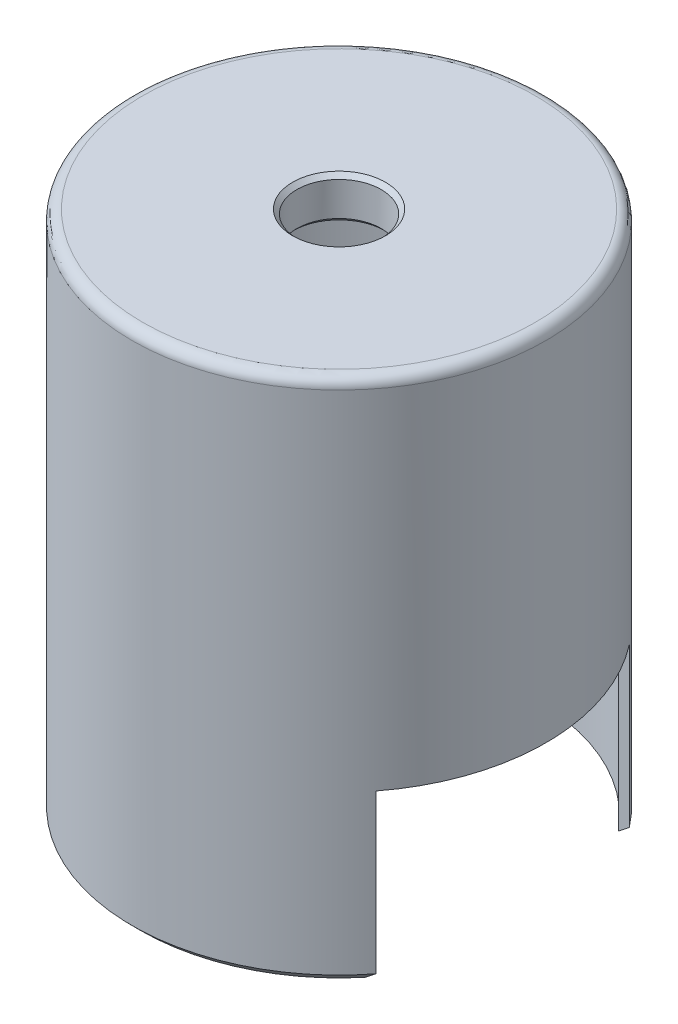
ISO-10303-21;
HEADER;
FILE_DESCRIPTION(('STEP AP214'),'2;1');
FILE_NAME('part.step','',(''),(''),'','','');
FILE_SCHEMA(('AUTOMOTIVE_DESIGN { 1 0 10303 214 1 1 1 1 }'));
ENDSEC;
DATA;
#1=APPLICATION_CONTEXT('core data for automotive mechanical design processes');
#2=APPLICATION_PROTOCOL_DEFINITION('international standard','automotive_design',2000,#1);
#3=PRODUCT_CONTEXT('',#1,'mechanical');
#4=PRODUCT('Part','Part','',(#3));
#5=PRODUCT_RELATED_PRODUCT_CATEGORY('part','',(#4));
#6=PRODUCT_DEFINITION_FORMATION('','',#4);
#7=PRODUCT_DEFINITION_CONTEXT('part definition',#1,'design');
#8=PRODUCT_DEFINITION('design','',#6,#7);
#9=PRODUCT_DEFINITION_SHAPE('','',#8);
#10=(LENGTH_UNIT() NAMED_UNIT(*) SI_UNIT(.MILLI.,.METRE.));
#11=(NAMED_UNIT(*) PLANE_ANGLE_UNIT() SI_UNIT($,.RADIAN.));
#12=(NAMED_UNIT(*) SI_UNIT($,.STERADIAN.) SOLID_ANGLE_UNIT());
#13=UNCERTAINTY_MEASURE_WITH_UNIT(LENGTH_MEASURE(1.E-05),#10,'distance_accuracy_value','');
#14=(GEOMETRIC_REPRESENTATION_CONTEXT(3) GLOBAL_UNCERTAINTY_ASSIGNED_CONTEXT((#13)) GLOBAL_UNIT_ASSIGNED_CONTEXT((#10,
#11,#12)) REPRESENTATION_CONTEXT('',''));
#15=CARTESIAN_POINT('',(0.,0.,0.));
#16=DIRECTION('',(0.,0.,1.));
#17=DIRECTION('',(1.,0.,0.));
#18=AXIS2_PLACEMENT_3D('',#15,#16,#17);
#19=CARTESIAN_POINT('',(0.,25.,0.));
#20=DIRECTION('',(0.,-1.,0.));
#21=DIRECTION('',(0.,0.,-1.));
#22=AXIS2_PLACEMENT_3D('',#19,#20,#21);
#23=CYLINDRICAL_SURFACE('',#22,9.8);
#24=CARTESIAN_POINT('',(0.,24.5,0.));
#25=DIRECTION('',(0.,1.,0.));
#26=DIRECTION('',(0.,0.,1.));
#27=AXIS2_PLACEMENT_3D('',#24,#25,#26);
#28=CIRCLE('',#27,9.8);
#29=CARTESIAN_POINT('',(0.,24.5,9.8));
#30=VERTEX_POINT('',#29);
#31=EDGE_CURVE('E168',#30,#30,#28,.F.);
#32=ORIENTED_EDGE('',*,*,#31,.T.);
#33=EDGE_LOOP('',(#32));
#34=FACE_BOUND('',#33,.T.);
#35=DIRECTION('',(0.,-1.,0.));
#36=VECTOR('',#35,1.);
#37=CARTESIAN_POINT('',(-7.74854825112421,25.,6.));
#38=LINE('',#37,#36);
#39=CARTESIAN_POINT('',(-7.74854825112421,8.00000000000001,6.));
#40=VERTEX_POINT('',#39);
#41=CARTESIAN_POINT('',(-7.74854825112421,0.500000000000007,6.));
#42=VERTEX_POINT('',#41);
#43=EDGE_CURVE('E157',#40,#42,#38,.T.);
#44=ORIENTED_EDGE('',*,*,#43,.T.);
#45=CARTESIAN_POINT('',(0.,0.500000000000007,0.));
#46=DIRECTION('',(0.,1.,0.));
#47=DIRECTION('',(0.,0.,1.));
#48=AXIS2_PLACEMENT_3D('',#45,#46,#47);
#49=CIRCLE('',#48,9.8);
#50=CARTESIAN_POINT('',(7.74854825112421,0.500000000000007,6.));
#51=VERTEX_POINT('',#50);
#52=EDGE_CURVE('E190',#42,#51,#49,.T.);
#53=ORIENTED_EDGE('',*,*,#52,.T.);
#54=DIRECTION('',(0.,-1.,0.));
#55=VECTOR('',#54,1.);
#56=CARTESIAN_POINT('',(7.74854825112421,25.,6.));
#57=LINE('',#56,#55);
#58=CARTESIAN_POINT('',(7.74854825112421,8.00000000000001,6.));
#59=VERTEX_POINT('',#58);
#60=EDGE_CURVE('E154',#51,#59,#57,.F.);
#61=ORIENTED_EDGE('',*,*,#60,.T.);
#62=CARTESIAN_POINT('',(0.,8.00000000000001,0.));
#63=DIRECTION('',(0.,1.,0.));
#64=DIRECTION('',(0.,0.,1.));
#65=AXIS2_PLACEMENT_3D('',#62,#63,#64);
#66=CIRCLE('',#65,9.8);
#67=CARTESIAN_POINT('',(7.74854825112421,8.00000000000001,-6.));
#68=VERTEX_POINT('',#67);
#69=EDGE_CURVE('E137',#59,#68,#66,.T.);
#70=ORIENTED_EDGE('',*,*,#69,.T.);
#71=DIRECTION('',(0.,-1.,0.));
#72=VECTOR('',#71,1.);
#73=CARTESIAN_POINT('',(7.74854825112421,25.,-6.));
#74=LINE('',#73,#72);
#75=CARTESIAN_POINT('',(7.74854825112421,0.500000000000007,-6.));
#76=VERTEX_POINT('',#75);
#77=EDGE_CURVE('E125',#68,#76,#74,.T.);
#78=ORIENTED_EDGE('',*,*,#77,.T.);
#79=CARTESIAN_POINT('',(0.,0.500000000000007,0.));
#80=DIRECTION('',(0.,1.,0.));
#81=DIRECTION('',(0.,0.,1.));
#82=AXIS2_PLACEMENT_3D('',#79,#80,#81);
#83=CIRCLE('',#82,9.8);
#84=CARTESIAN_POINT('',(-7.74854825112421,0.500000000000007,-6.));
#85=VERTEX_POINT('',#84);
#86=EDGE_CURVE('E122',#76,#85,#83,.T.);
#87=ORIENTED_EDGE('',*,*,#86,.T.);
#88=DIRECTION('',(0.,-1.,0.));
#89=VECTOR('',#88,1.);
#90=CARTESIAN_POINT('',(-7.74854825112421,25.,-6.));
#91=LINE('',#90,#89);
#92=CARTESIAN_POINT('',(-7.74854825112421,8.00000000000001,-6.));
#93=VERTEX_POINT('',#92);
#94=EDGE_CURVE('E115',#85,#93,#91,.F.);
#95=ORIENTED_EDGE('',*,*,#94,.T.);
#96=EDGE_CURVE('E118',#93,#40,#66,.T.);
#97=ORIENTED_EDGE('',*,*,#96,.T.);
#98=EDGE_LOOP('',(#44,#53,#61,#70,#78,#87,#95,#97));
#99=FACE_BOUND('',#98,.T.);
#100=ADVANCED_FACE('F49',(#34,#99),#23,.T.);
#101=CARTESIAN_POINT('',(0.,25.,0.));
#102=DIRECTION('',(0.,1.,0.));
#103=DIRECTION('',(0.,0.,1.));
#104=AXIS2_PLACEMENT_3D('',#101,#102,#103);
#105=PLANE('',#104);
#106=CARTESIAN_POINT('',(0.,25.,0.));
#107=DIRECTION('',(0.,1.,0.));
#108=DIRECTION('',(0.,0.,1.));
#109=AXIS2_PLACEMENT_3D('',#106,#107,#108);
#110=CIRCLE('',#109,2.2);
#111=CARTESIAN_POINT('',(0.,25.,2.2));
#112=VERTEX_POINT('',#111);
#113=EDGE_CURVE('E11',#112,#112,#110,.F.);
#114=ORIENTED_EDGE('',*,*,#113,.T.);
#115=EDGE_LOOP('',(#114));
#116=FACE_BOUND('',#115,.T.);
#117=CARTESIAN_POINT('',(0.,25.,0.));
#118=DIRECTION('',(0.,1.,0.));
#119=DIRECTION('',(0.,0.,1.));
#120=AXIS2_PLACEMENT_3D('',#117,#118,#119);
#121=CIRCLE('',#120,9.3);
#122=CARTESIAN_POINT('',(0.,25.,9.3));
#123=VERTEX_POINT('',#122);
#124=EDGE_CURVE('E164',#123,#123,#121,.T.);
#125=ORIENTED_EDGE('',*,*,#124,.T.);
#126=EDGE_LOOP('',(#125));
#127=FACE_BOUND('',#126,.T.);
#128=ADVANCED_FACE('F268',(#116,#127),#105,.T.);
#129=CARTESIAN_POINT('',(0.,24.5,0.));
#130=DIRECTION('',(0.,1.,0.));
#131=DIRECTION('',(0.,0.,1.));
#132=AXIS2_PLACEMENT_3D('',#129,#130,#131);
#133=TOROIDAL_SURFACE('',#132,9.3,0.5);
#134=ORIENTED_EDGE('',*,*,#31,.F.);
#135=EDGE_LOOP('',(#134));
#136=FACE_BOUND('',#135,.T.);
#137=ORIENTED_EDGE('',*,*,#124,.F.);
#138=EDGE_LOOP('',(#137));
#139=FACE_BOUND('',#138,.T.);
#140=ADVANCED_FACE('F276',(#136,#139),#133,.T.);
#141=CARTESIAN_POINT('',(0.,23.,0.));
#142=DIRECTION('',(0.,-1.,0.));
#143=DIRECTION('',(0.,0.,-1.));
#144=AXIS2_PLACEMENT_3D('',#141,#142,#143);
#145=CYLINDRICAL_SURFACE('',#144,9.4);
#146=CARTESIAN_POINT('',(0.,23.,0.));
#147=DIRECTION('',(0.,-1.,0.));
#148=DIRECTION('',(0.,0.,-1.));
#149=AXIS2_PLACEMENT_3D('',#146,#147,#148);
#150=CIRCLE('',#149,9.4);
#151=CARTESIAN_POINT('',(0.,23.,-9.4));
#152=VERTEX_POINT('',#151);
#153=EDGE_CURVE('E160',#152,#152,#150,.T.);
#154=ORIENTED_EDGE('',*,*,#153,.F.);
#155=EDGE_LOOP('',(#154));
#156=FACE_BOUND('',#155,.T.);
#157=DIRECTION('',(0.,-1.,0.));
#158=VECTOR('',#157,1.);
#159=CARTESIAN_POINT('',(7.23602100605022,23.,6.));
#160=LINE('',#159,#158);
#161=CARTESIAN_POINT('',(7.23602100605022,8.,6.));
#162=VERTEX_POINT('',#161);
#163=CARTESIAN_POINT('',(7.23602100605022,0.100000000000003,6.));
#164=VERTEX_POINT('',#163);
#165=EDGE_CURVE('E184',#162,#164,#160,.T.);
#166=ORIENTED_EDGE('',*,*,#165,.T.);
#167=CARTESIAN_POINT('',(0.,0.100000000000002,0.));
#168=DIRECTION('',(0.,1.,0.));
#169=DIRECTION('',(0.,0.,1.));
#170=AXIS2_PLACEMENT_3D('',#167,#168,#169);
#171=CIRCLE('',#170,9.4);
#172=CARTESIAN_POINT('',(-7.23602100605022,0.100000000000003,6.));
#173=VERTEX_POINT('',#172);
#174=EDGE_CURVE('E230',#164,#173,#171,.F.);
#175=ORIENTED_EDGE('',*,*,#174,.T.);
#176=DIRECTION('',(0.,-1.,0.));
#177=VECTOR('',#176,1.);
#178=CARTESIAN_POINT('',(-7.23602100605022,23.,6.));
#179=LINE('',#178,#177);
#180=CARTESIAN_POINT('',(-7.23602100605022,8.,6.));
#181=VERTEX_POINT('',#180);
#182=EDGE_CURVE('E177',#173,#181,#179,.F.);
#183=ORIENTED_EDGE('',*,*,#182,.T.);
#184=CARTESIAN_POINT('',(0.,8.,0.));
#185=DIRECTION('',(0.,1.,0.));
#186=DIRECTION('',(0.,0.,1.));
#187=AXIS2_PLACEMENT_3D('',#184,#185,#186);
#188=CIRCLE('',#187,9.4);
#189=CARTESIAN_POINT('',(-7.23602100605022,8.00000000000001,-6.));
#190=VERTEX_POINT('',#189);
#191=EDGE_CURVE('E174',#181,#190,#188,.F.);
#192=ORIENTED_EDGE('',*,*,#191,.T.);
#193=DIRECTION('',(0.,-1.,0.));
#194=VECTOR('',#193,1.);
#195=CARTESIAN_POINT('',(-7.23602100605022,23.,-6.));
#196=LINE('',#195,#194);
#197=CARTESIAN_POINT('',(-7.23602100605022,0.100000000000003,-6.));
#198=VERTEX_POINT('',#197);
#199=EDGE_CURVE('E140',#190,#198,#196,.T.);
#200=ORIENTED_EDGE('',*,*,#199,.T.);
#201=CARTESIAN_POINT('',(0.,0.100000000000002,0.));
#202=DIRECTION('',(0.,1.,0.));
#203=DIRECTION('',(0.,0.,1.));
#204=AXIS2_PLACEMENT_3D('',#201,#202,#203);
#205=CIRCLE('',#204,9.4);
#206=CARTESIAN_POINT('',(7.23602100605022,0.100000000000003,-6.));
#207=VERTEX_POINT('',#206);
#208=EDGE_CURVE('E66',#198,#207,#205,.F.);
#209=ORIENTED_EDGE('',*,*,#208,.T.);
#210=DIRECTION('',(0.,-1.,0.));
#211=VECTOR('',#210,1.);
#212=CARTESIAN_POINT('',(7.23602100605022,23.,-6.));
#213=LINE('',#212,#211);
#214=CARTESIAN_POINT('',(7.23602100605022,8.00000000000001,-6.));
#215=VERTEX_POINT('',#214);
#216=EDGE_CURVE('E181',#207,#215,#213,.F.);
#217=ORIENTED_EDGE('',*,*,#216,.T.);
#218=EDGE_CURVE('E178',#215,#162,#188,.F.);
#219=ORIENTED_EDGE('',*,*,#218,.T.);
#220=EDGE_LOOP('',(#166,#175,#183,#192,#200,#209,#217,#219));
#221=FACE_BOUND('',#220,.T.);
#222=ADVANCED_FACE('F280',(#156,#221),#145,.F.);
#223=CARTESIAN_POINT('',(0.,23.,0.));
#224=DIRECTION('',(0.,-1.,0.));
#225=DIRECTION('',(0.,0.,-1.));
#226=AXIS2_PLACEMENT_3D('',#223,#224,#225);
#227=PLANE('',#226);
#228=CARTESIAN_POINT('',(0.,23.,0.));
#229=DIRECTION('',(0.,-1.,0.));
#230=DIRECTION('',(0.,0.,-1.));
#231=AXIS2_PLACEMENT_3D('',#228,#229,#230);
#232=CIRCLE('',#231,2.2);
#233=CARTESIAN_POINT('',(0.,23.,-2.2));
#234=VERTEX_POINT('',#233);
#235=EDGE_CURVE('E59',#234,#234,#232,.F.);
#236=ORIENTED_EDGE('',*,*,#235,.T.);
#237=EDGE_LOOP('',(#236));
#238=FACE_BOUND('',#237,.T.);
#239=ORIENTED_EDGE('',*,*,#153,.T.);
#240=EDGE_LOOP('',(#239));
#241=FACE_BOUND('',#240,.T.);
#242=ADVANCED_FACE('F219',(#238,#241),#227,.T.);
#243=CARTESIAN_POINT('',(-9.8,-7.99999999999999,-6.));
#244=DIRECTION('',(0.,0.,-1.));
#245=DIRECTION('',(-1.,0.,0.));
#246=AXIS2_PLACEMENT_3D('',#243,#244,#245);
#247=PLANE('',#246);
#248=ORIENTED_EDGE('',*,*,#94,.F.);
#249=CARTESIAN_POINT('',(-7.74854825112421,0.500000000000007,-6.));
#250=CARTESIAN_POINT('',(-7.66355939342048,0.432779394274704,-6.));
#251=CARTESIAN_POINT('',(-7.57835437021619,0.3658357653202,-6.));
#252=CARTESIAN_POINT('',(-7.40751195538094,0.232502431744162,-6.));
#253=CARTESIAN_POINT('',(-7.32187456356057,0.16611272736533,-6.));
#254=CARTESIAN_POINT('',(-7.23602100605022,0.100000000000001,-6.));
#255=B_SPLINE_CURVE_WITH_KNOTS('',3,(#249,#250,#251,#252,#253,#254),.UNSPECIFIED.,.F.,.F.,(4,2,
4),(0.,0.325072467200125,0.650145076824106),.UNSPECIFIED.);
#256=EDGE_CURVE('E74',#85,#198,#255,.T.);
#257=ORIENTED_EDGE('',*,*,#256,.T.);
#258=ORIENTED_EDGE('',*,*,#199,.F.);
#259=DIRECTION('',(1.,0.,0.));
#260=VECTOR('',#259,1.);
#261=CARTESIAN_POINT('',(-9.8,8.00000000000001,-6.));
#262=LINE('',#261,#260);
#263=EDGE_CURVE('E133',#93,#190,#262,.T.);
#264=ORIENTED_EDGE('',*,*,#263,.F.);
#265=EDGE_LOOP('',(#248,#257,#258,#264));
#266=FACE_BOUND('',#265,.T.);
#267=ADVANCED_FACE('F139',(#266),#247,.F.);
#268=CARTESIAN_POINT('',(-9.8,8.00000000000001,-6.));
#269=DIRECTION('',(0.,1.,0.));
#270=DIRECTION('',(0.,0.,1.));
#271=AXIS2_PLACEMENT_3D('',#268,#269,#270);
#272=PLANE('',#271);
#273=ORIENTED_EDGE('',*,*,#263,.T.);
#274=ORIENTED_EDGE('',*,*,#191,.F.);
#275=DIRECTION('',(1.,0.,0.));
#276=VECTOR('',#275,1.);
#277=CARTESIAN_POINT('',(-9.8,8.,6.));
#278=LINE('',#277,#276);
#279=EDGE_CURVE('E126',#40,#181,#278,.T.);
#280=ORIENTED_EDGE('',*,*,#279,.F.);
#281=ORIENTED_EDGE('',*,*,#96,.F.);
#282=EDGE_LOOP('',(#273,#274,#280,#281));
#283=FACE_BOUND('',#282,.T.);
#284=ADVANCED_FACE('F131',(#283),#272,.F.);
#285=CARTESIAN_POINT('',(-9.8,-8.,6.));
#286=DIRECTION('',(0.,0.,1.));
#287=DIRECTION('',(1.,0.,0.));
#288=AXIS2_PLACEMENT_3D('',#285,#286,#287);
#289=PLANE('',#288);
#290=ORIENTED_EDGE('',*,*,#182,.F.);
#291=CARTESIAN_POINT('',(-7.23602100605022,0.100000000000001,6.));
#292=CARTESIAN_POINT('',(-7.32187456356057,0.16611272736533,6.));
#293=CARTESIAN_POINT('',(-7.40751195538094,0.232502431744162,6.));
#294=CARTESIAN_POINT('',(-7.57835437021619,0.3658357653202,6.));
#295=CARTESIAN_POINT('',(-7.66355939342048,0.432779394274704,6.));
#296=CARTESIAN_POINT('',(-7.74854825112421,0.500000000000007,6.));
#297=B_SPLINE_CURVE_WITH_KNOTS('',3,(#291,#292,#293,#294,#295,#296),.UNSPECIFIED.,.F.,.F.,(4,2,
4),(0.,0.325072609623981,0.650145076824106),.UNSPECIFIED.);
#298=EDGE_CURVE('E223',#173,#42,#297,.T.);
#299=ORIENTED_EDGE('',*,*,#298,.T.);
#300=ORIENTED_EDGE('',*,*,#43,.F.);
#301=ORIENTED_EDGE('',*,*,#279,.T.);
#302=EDGE_LOOP('',(#290,#299,#300,#301));
#303=FACE_BOUND('',#302,.T.);
#304=ADVANCED_FACE('F209',(#303),#289,.F.);
#305=ORIENTED_EDGE('',*,*,#60,.F.);
#306=CARTESIAN_POINT('',(7.74854825112421,0.500000000000007,6.));
#307=CARTESIAN_POINT('',(7.66355939342048,0.432779394274704,6.));
#308=CARTESIAN_POINT('',(7.57835437021619,0.3658357653202,6.));
#309=CARTESIAN_POINT('',(7.40751195538094,0.232502431744162,6.));
#310=CARTESIAN_POINT('',(7.32187456356057,0.16611272736533,6.));
#311=CARTESIAN_POINT('',(7.23602100605022,0.100000000000001,6.));
#312=B_SPLINE_CURVE_WITH_KNOTS('',3,(#306,#307,#308,#309,#310,#311),.UNSPECIFIED.,.F.,.F.,(4,2,
4),(0.,0.325072467200125,0.650145076824106),.UNSPECIFIED.);
#313=EDGE_CURVE('E194',#51,#164,#312,.T.);
#314=ORIENTED_EDGE('',*,*,#313,.T.);
#315=ORIENTED_EDGE('',*,*,#165,.F.);
#316=EDGE_CURVE('E142',#162,#59,#278,.T.);
#317=ORIENTED_EDGE('',*,*,#316,.T.);
#318=EDGE_LOOP('',(#305,#314,#315,#317));
#319=FACE_BOUND('',#318,.T.);
#320=ADVANCED_FACE('F214',(#319),#289,.F.);
#321=ORIENTED_EDGE('',*,*,#316,.F.);
#322=ORIENTED_EDGE('',*,*,#218,.F.);
#323=EDGE_CURVE('E143',#215,#68,#262,.T.);
#324=ORIENTED_EDGE('',*,*,#323,.T.);
#325=ORIENTED_EDGE('',*,*,#69,.F.);
#326=EDGE_LOOP('',(#321,#322,#324,#325));
#327=FACE_BOUND('',#326,.T.);
#328=ADVANCED_FACE('F312',(#327),#272,.F.);
#329=ORIENTED_EDGE('',*,*,#216,.F.);
#330=CARTESIAN_POINT('',(7.23602100605022,0.100000000000001,-6.));
#331=CARTESIAN_POINT('',(7.32187456356057,0.16611272736533,-6.));
#332=CARTESIAN_POINT('',(7.40751195538094,0.232502431744162,-6.));
#333=CARTESIAN_POINT('',(7.57835437021619,0.3658357653202,-6.));
#334=CARTESIAN_POINT('',(7.66355939342048,0.432779394274704,-6.));
#335=CARTESIAN_POINT('',(7.74854825112421,0.500000000000007,-6.));
#336=B_SPLINE_CURVE_WITH_KNOTS('',3,(#330,#331,#332,#333,#334,#335),.UNSPECIFIED.,.F.,.F.,(4,2,
4),(0.,0.325072609623982,0.650145076824106),.UNSPECIFIED.);
#337=EDGE_CURVE('E237',#207,#76,#336,.T.);
#338=ORIENTED_EDGE('',*,*,#337,.T.);
#339=ORIENTED_EDGE('',*,*,#77,.F.);
#340=ORIENTED_EDGE('',*,*,#323,.F.);
#341=EDGE_LOOP('',(#329,#338,#339,#340));
#342=FACE_BOUND('',#341,.T.);
#343=ADVANCED_FACE('F216',(#342),#247,.F.);
#344=CARTESIAN_POINT('',(0.,0.500000000000007,0.));
#345=DIRECTION('',(0.,1.,0.));
#346=DIRECTION('',(0.,0.,1.));
#347=AXIS2_PLACEMENT_3D('',#344,#345,#346);
#348=CONICAL_SURFACE('',#347,9.8,0.785398163397445);
#349=ORIENTED_EDGE('',*,*,#298,.F.);
#350=ORIENTED_EDGE('',*,*,#174,.F.);
#351=ORIENTED_EDGE('',*,*,#313,.F.);
#352=ORIENTED_EDGE('',*,*,#52,.F.);
#353=EDGE_LOOP('',(#349,#350,#351,#352));
#354=FACE_BOUND('',#353,.T.);
#355=ADVANCED_FACE('F205',(#354),#348,.T.);
#356=CARTESIAN_POINT('',(0.,0.500000000000007,0.));
#357=DIRECTION('',(0.,1.,0.));
#358=DIRECTION('',(0.,0.,1.));
#359=AXIS2_PLACEMENT_3D('',#356,#357,#358);
#360=CONICAL_SURFACE('',#359,9.8,0.785398163397445);
#361=ORIENTED_EDGE('',*,*,#337,.F.);
#362=ORIENTED_EDGE('',*,*,#208,.F.);
#363=ORIENTED_EDGE('',*,*,#256,.F.);
#364=ORIENTED_EDGE('',*,*,#86,.F.);
#365=EDGE_LOOP('',(#361,#362,#363,#364));
#366=FACE_BOUND('',#365,.T.);
#367=ADVANCED_FACE('F244',(#366),#360,.T.);
#368=CARTESIAN_POINT('',(0.,0.100000000000003,0.));
#369=DIRECTION('',(0.,1.,0.));
#370=DIRECTION('',(0.,0.,1.));
#371=AXIS2_PLACEMENT_3D('',#368,#369,#370);
#372=CYLINDRICAL_SURFACE('',#371,2.);
#373=CARTESIAN_POINT('',(0.,23.2,0.));
#374=DIRECTION('',(0.,-1.,0.));
#375=DIRECTION('',(0.,0.,-1.));
#376=AXIS2_PLACEMENT_3D('',#373,#374,#375);
#377=CIRCLE('',#376,2.);
#378=CARTESIAN_POINT('',(0.,23.2,-2.));
#379=VERTEX_POINT('',#378);
#380=EDGE_CURVE('E321',#379,#379,#377,.T.);
#381=ORIENTED_EDGE('',*,*,#380,.T.);
#382=EDGE_LOOP('',(#381));
#383=FACE_BOUND('',#382,.T.);
#384=CARTESIAN_POINT('',(0.,24.8,0.));
#385=DIRECTION('',(0.,1.,0.));
#386=DIRECTION('',(0.,0.,1.));
#387=AXIS2_PLACEMENT_3D('',#384,#385,#386);
#388=CIRCLE('',#387,2.);
#389=CARTESIAN_POINT('',(0.,24.8,2.));
#390=VERTEX_POINT('',#389);
#391=EDGE_CURVE('E318',#390,#390,#388,.T.);
#392=ORIENTED_EDGE('',*,*,#391,.T.);
#393=EDGE_LOOP('',(#392));
#394=FACE_BOUND('',#393,.T.);
#395=ADVANCED_FACE('F250',(#383,#394),#372,.F.);
#396=CARTESIAN_POINT('',(0.,23.2,0.));
#397=DIRECTION('',(0.,-1.,0.));
#398=DIRECTION('',(0.,0.,-1.));
#399=AXIS2_PLACEMENT_3D('',#396,#397,#398);
#400=CONICAL_SURFACE('',#399,2.,0.785398163397453);
#401=ORIENTED_EDGE('',*,*,#235,.F.);
#402=EDGE_LOOP('',(#401));
#403=FACE_BOUND('',#402,.T.);
#404=ORIENTED_EDGE('',*,*,#380,.F.);
#405=EDGE_LOOP('',(#404));
#406=FACE_BOUND('',#405,.T.);
#407=ADVANCED_FACE('F252',(#403,#406),#400,.F.);
#408=CARTESIAN_POINT('',(0.,24.8,0.));
#409=DIRECTION('',(0.,1.,0.));
#410=DIRECTION('',(0.,0.,1.));
#411=AXIS2_PLACEMENT_3D('',#408,#409,#410);
#412=CONICAL_SURFACE('',#411,2.,0.785398163397453);
#413=ORIENTED_EDGE('',*,*,#113,.F.);
#414=EDGE_LOOP('',(#413));
#415=FACE_BOUND('',#414,.T.);
#416=ORIENTED_EDGE('',*,*,#391,.F.);
#417=EDGE_LOOP('',(#416));
#418=FACE_BOUND('',#417,.T.);
#419=ADVANCED_FACE('F52',(#415,#418),#412,.F.);
#420=CLOSED_SHELL('',(#100,#128,#140,#222,#242,#267,#284,#304,#320,#328,#343,#355,#367,#395,
#407,#419));
#421=MANIFOLD_SOLID_BREP('B2',#420);
#422=ADVANCED_BREP_SHAPE_REPRESENTATION('',(#18,#421),#14);
#423=SHAPE_DEFINITION_REPRESENTATION(#9,#422);
ENDSEC;
END-ISO-10303-21;
